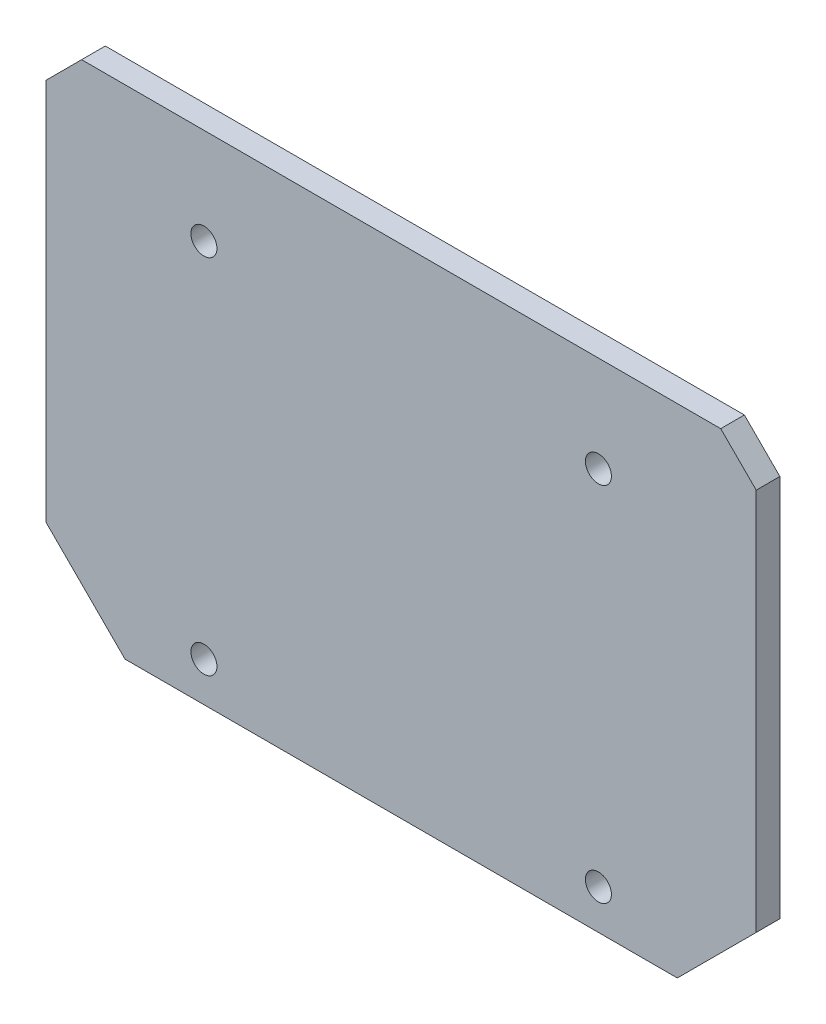
ISO-10303-21;
HEADER;
FILE_DESCRIPTION(('STEP AP214'),'2;1');
FILE_NAME('part.step','',(''),(''),'','','');
FILE_SCHEMA(('AUTOMOTIVE_DESIGN { 1 0 10303 214 1 1 1 1 }'));
ENDSEC;
DATA;
#1=APPLICATION_CONTEXT('core data for automotive mechanical design processes');
#2=APPLICATION_PROTOCOL_DEFINITION('international standard','automotive_design',2000,#1);
#3=PRODUCT_CONTEXT('',#1,'mechanical');
#4=PRODUCT('Part','Part','',(#3));
#5=PRODUCT_RELATED_PRODUCT_CATEGORY('part','',(#4));
#6=PRODUCT_DEFINITION_FORMATION('','',#4);
#7=PRODUCT_DEFINITION_CONTEXT('part definition',#1,'design');
#8=PRODUCT_DEFINITION('design','',#6,#7);
#9=PRODUCT_DEFINITION_SHAPE('','',#8);
#10=(LENGTH_UNIT() NAMED_UNIT(*) SI_UNIT(.MILLI.,.METRE.));
#11=(NAMED_UNIT(*) PLANE_ANGLE_UNIT() SI_UNIT($,.RADIAN.));
#12=(NAMED_UNIT(*) SI_UNIT($,.STERADIAN.) SOLID_ANGLE_UNIT());
#13=UNCERTAINTY_MEASURE_WITH_UNIT(LENGTH_MEASURE(1.E-05),#10,'distance_accuracy_value','');
#14=(GEOMETRIC_REPRESENTATION_CONTEXT(3) GLOBAL_UNCERTAINTY_ASSIGNED_CONTEXT((#13)) GLOBAL_UNIT_ASSIGNED_CONTEXT((#10,
#11,#12)) REPRESENTATION_CONTEXT('',''));
#15=CARTESIAN_POINT('',(0.,0.,0.));
#16=DIRECTION('',(0.,0.,1.));
#17=DIRECTION('',(1.,0.,0.));
#18=AXIS2_PLACEMENT_3D('',#15,#16,#17);
#19=CARTESIAN_POINT('',(0.,0.,3.));
#20=DIRECTION('',(0.,0.,-1.));
#21=DIRECTION('',(-1.,0.,0.));
#22=AXIS2_PLACEMENT_3D('',#19,#20,#21);
#23=PLANE('',#22);
#24=CARTESIAN_POINT('',(-39.4471834230936,-108.639958181663,3.));
#25=DIRECTION('',(0.,0.,1.));
#26=DIRECTION('',(-1.,0.,0.));
#27=AXIS2_PLACEMENT_3D('',#24,#25,#26);
#28=CIRCLE('',#27,1.65);
#29=CARTESIAN_POINT('',(-41.0971834230936,-108.639958181663,3.));
#30=VERTEX_POINT('',#29);
#31=EDGE_CURVE('E184',#30,#30,#28,.T.);
#32=ORIENTED_EDGE('',*,*,#31,.F.);
#33=EDGE_LOOP('',(#32));
#34=FACE_BOUND('',#33,.T.);
#35=CARTESIAN_POINT('',(10.5528165769064,-108.639958181663,3.));
#36=DIRECTION('',(0.,0.,1.));
#37=DIRECTION('',(-1.,0.,0.));
#38=AXIS2_PLACEMENT_3D('',#35,#36,#37);
#39=CIRCLE('',#38,1.65);
#40=CARTESIAN_POINT('',(8.90281657690642,-108.639958181663,3.));
#41=VERTEX_POINT('',#40);
#42=EDGE_CURVE('E132',#41,#41,#39,.T.);
#43=ORIENTED_EDGE('',*,*,#42,.F.);
#44=EDGE_LOOP('',(#43));
#45=FACE_BOUND('',#44,.T.);
#46=DIRECTION('',(-0.70710678118655,0.707106781186545,0.));
#47=VECTOR('',#46,1.);
#48=CARTESIAN_POINT('',(26.0528165769063,-50.5907351629899,3.));
#49=LINE('',#48,#47);
#50=CARTESIAN_POINT('',(30.5528165769063,-55.0907351629899,3.));
#51=VERTEX_POINT('',#50);
#52=CARTESIAN_POINT('',(26.0528165769063,-50.5907351629899,3.));
#53=VERTEX_POINT('',#52);
#54=EDGE_CURVE('E123',#51,#53,#49,.T.);
#55=ORIENTED_EDGE('',*,*,#54,.T.);
#56=DIRECTION('',(-1.,0.,0.));
#57=VECTOR('',#56,1.);
#58=CARTESIAN_POINT('',(-54.4471834230937,-50.59073516299,3.));
#59=LINE('',#58,#57);
#60=CARTESIAN_POINT('',(-54.9471834230937,-50.59073516299,3.));
#61=VERTEX_POINT('',#60);
#62=EDGE_CURVE('E49',#53,#61,#59,.T.);
#63=ORIENTED_EDGE('',*,*,#62,.T.);
#64=DIRECTION('',(-0.707106781186548,-0.707106781186548,0.));
#65=VECTOR('',#64,1.);
#66=CARTESIAN_POINT('',(-54.9471834230937,-50.59073516299,3.));
#67=LINE('',#66,#65);
#68=CARTESIAN_POINT('',(-59.4471834230937,-55.09073516299,3.));
#69=VERTEX_POINT('',#68);
#70=EDGE_CURVE('E178',#61,#69,#67,.T.);
#71=ORIENTED_EDGE('',*,*,#70,.T.);
#72=DIRECTION('',(0.,-1.,0.));
#73=VECTOR('',#72,1.);
#74=CARTESIAN_POINT('',(-59.4471834230937,-55.09073516299,3.));
#75=LINE('',#74,#73);
#76=CARTESIAN_POINT('',(-59.4471834230937,-103.639958181663,3.));
#77=VERTEX_POINT('',#76);
#78=EDGE_CURVE('E158',#69,#77,#75,.T.);
#79=ORIENTED_EDGE('',*,*,#78,.T.);
#80=DIRECTION('',(0.707106781186548,-0.707106781186547,0.));
#81=VECTOR('',#80,1.);
#82=CARTESIAN_POINT('',(-59.4471834230937,-103.639958181663,3.));
#83=LINE('',#82,#81);
#84=CARTESIAN_POINT('',(-49.4471834230937,-113.639958181663,3.));
#85=VERTEX_POINT('',#84);
#86=EDGE_CURVE('E174',#77,#85,#83,.T.);
#87=ORIENTED_EDGE('',*,*,#86,.T.);
#88=DIRECTION('',(1.,0.,0.));
#89=VECTOR('',#88,1.);
#90=CARTESIAN_POINT('',(-49.4471834230937,-113.639958181663,3.));
#91=LINE('',#90,#89);
#92=CARTESIAN_POINT('',(20.5528165769063,-113.639958181663,3.));
#93=VERTEX_POINT('',#92);
#94=EDGE_CURVE('E109',#85,#93,#91,.T.);
#95=ORIENTED_EDGE('',*,*,#94,.T.);
#96=DIRECTION('',(0.707106781186548,0.707106781186547,0.));
#97=VECTOR('',#96,1.);
#98=CARTESIAN_POINT('',(30.5528165769063,-103.639958181663,3.));
#99=LINE('',#98,#97);
#100=CARTESIAN_POINT('',(30.5528165769063,-103.639958181663,3.));
#101=VERTEX_POINT('',#100);
#102=EDGE_CURVE('E103',#93,#101,#99,.T.);
#103=ORIENTED_EDGE('',*,*,#102,.T.);
#104=DIRECTION('',(0.,1.,0.));
#105=VECTOR('',#104,1.);
#106=CARTESIAN_POINT('',(30.5528165769063,-55.0907351629899,3.));
#107=LINE('',#106,#105);
#108=EDGE_CURVE('E107',#101,#51,#107,.T.);
#109=ORIENTED_EDGE('',*,*,#108,.T.);
#110=EDGE_LOOP('',(#55,#63,#71,#79,#87,#95,#103,#109));
#111=FACE_BOUND('',#110,.T.);
#112=CARTESIAN_POINT('',(10.5528165769064,-62.7480571612415,3.));
#113=DIRECTION('',(0.,0.,1.));
#114=DIRECTION('',(1.,0.,0.));
#115=AXIS2_PLACEMENT_3D('',#112,#113,#114);
#116=CIRCLE('',#115,1.65);
#117=CARTESIAN_POINT('',(12.2028165769064,-62.7480571612415,3.));
#118=VERTEX_POINT('',#117);
#119=EDGE_CURVE('E190',#118,#118,#116,.T.);
#120=ORIENTED_EDGE('',*,*,#119,.F.);
#121=EDGE_LOOP('',(#120));
#122=FACE_BOUND('',#121,.T.);
#123=CARTESIAN_POINT('',(-39.4471834230938,-62.7480571612414,3.));
#124=DIRECTION('',(0.,0.,1.));
#125=DIRECTION('',(-1.,0.,0.));
#126=AXIS2_PLACEMENT_3D('',#123,#124,#125);
#127=CIRCLE('',#126,1.65);
#128=CARTESIAN_POINT('',(-41.0971834230938,-62.7480571612414,3.));
#129=VERTEX_POINT('',#128);
#130=EDGE_CURVE('E196',#129,#129,#127,.T.);
#131=ORIENTED_EDGE('',*,*,#130,.F.);
#132=EDGE_LOOP('',(#131));
#133=FACE_BOUND('',#132,.T.);
#134=ADVANCED_FACE('F32',(#34,#45,#111,#122,#133),#23,.F.);
#135=CARTESIAN_POINT('',(0.,0.,0.));
#136=DIRECTION('',(0.,0.,-1.));
#137=DIRECTION('',(-1.,0.,0.));
#138=AXIS2_PLACEMENT_3D('',#135,#136,#137);
#139=PLANE('',#138);
#140=DIRECTION('',(-0.707106781186548,-0.707106781186548,0.));
#141=VECTOR('',#140,1.);
#142=CARTESIAN_POINT('',(-54.9471834230937,-50.59073516299,0.));
#143=LINE('',#142,#141);
#144=CARTESIAN_POINT('',(-54.9471834230937,-50.59073516299,0.));
#145=VERTEX_POINT('',#144);
#146=CARTESIAN_POINT('',(-59.4471834230937,-55.09073516299,0.));
#147=VERTEX_POINT('',#146);
#148=EDGE_CURVE('E129',#145,#147,#143,.T.);
#149=ORIENTED_EDGE('',*,*,#148,.F.);
#150=DIRECTION('',(-1.,0.,0.));
#151=VECTOR('',#150,1.);
#152=CARTESIAN_POINT('',(25.5528165769063,-50.5907351629899,0.));
#153=LINE('',#152,#151);
#154=CARTESIAN_POINT('',(26.0528165769063,-50.5907351629899,0.));
#155=VERTEX_POINT('',#154);
#156=EDGE_CURVE('E141',#155,#145,#153,.T.);
#157=ORIENTED_EDGE('',*,*,#156,.F.);
#158=DIRECTION('',(-0.70710678118655,0.707106781186545,0.));
#159=VECTOR('',#158,1.);
#160=CARTESIAN_POINT('',(26.0528165769063,-50.5907351629899,0.));
#161=LINE('',#160,#159);
#162=CARTESIAN_POINT('',(30.5528165769063,-55.0907351629899,0.));
#163=VERTEX_POINT('',#162);
#164=EDGE_CURVE('E86',#163,#155,#161,.T.);
#165=ORIENTED_EDGE('',*,*,#164,.F.);
#166=DIRECTION('',(0.,1.,0.));
#167=VECTOR('',#166,1.);
#168=CARTESIAN_POINT('',(30.5528165769063,-55.0907351629899,0.));
#169=LINE('',#168,#167);
#170=CARTESIAN_POINT('',(30.5528165769063,-103.639958181663,0.));
#171=VERTEX_POINT('',#170);
#172=EDGE_CURVE('E79',#171,#163,#169,.T.);
#173=ORIENTED_EDGE('',*,*,#172,.F.);
#174=DIRECTION('',(0.707106781186548,0.707106781186547,0.));
#175=VECTOR('',#174,1.);
#176=CARTESIAN_POINT('',(30.5528165769063,-103.639958181663,0.));
#177=LINE('',#176,#175);
#178=CARTESIAN_POINT('',(20.5528165769063,-113.639958181663,0.));
#179=VERTEX_POINT('',#178);
#180=EDGE_CURVE('E117',#179,#171,#177,.T.);
#181=ORIENTED_EDGE('',*,*,#180,.F.);
#182=DIRECTION('',(1.,0.,0.));
#183=VECTOR('',#182,1.);
#184=CARTESIAN_POINT('',(-49.4471834230937,-113.639958181663,0.));
#185=LINE('',#184,#183);
#186=CARTESIAN_POINT('',(-49.4471834230937,-113.639958181663,0.));
#187=VERTEX_POINT('',#186);
#188=EDGE_CURVE('E136',#187,#179,#185,.T.);
#189=ORIENTED_EDGE('',*,*,#188,.F.);
#190=DIRECTION('',(0.707106781186548,-0.707106781186547,0.));
#191=VECTOR('',#190,1.);
#192=CARTESIAN_POINT('',(-59.4471834230937,-103.639958181663,0.));
#193=LINE('',#192,#191);
#194=CARTESIAN_POINT('',(-59.4471834230937,-103.639958181663,0.));
#195=VERTEX_POINT('',#194);
#196=EDGE_CURVE('E134',#195,#187,#193,.T.);
#197=ORIENTED_EDGE('',*,*,#196,.F.);
#198=DIRECTION('',(0.,-1.,0.));
#199=VECTOR('',#198,1.);
#200=CARTESIAN_POINT('',(-59.4471834230937,-55.09073516299,0.));
#201=LINE('',#200,#199);
#202=EDGE_CURVE('E131',#147,#195,#201,.T.);
#203=ORIENTED_EDGE('',*,*,#202,.F.);
#204=EDGE_LOOP('',(#149,#157,#165,#173,#181,#189,#197,#203));
#205=FACE_BOUND('',#204,.T.);
#206=CARTESIAN_POINT('',(10.5528165769064,-62.7480571612415,0.));
#207=DIRECTION('',(0.,0.,1.));
#208=DIRECTION('',(1.,0.,0.));
#209=AXIS2_PLACEMENT_3D('',#206,#207,#208);
#210=CIRCLE('',#209,1.65);
#211=CARTESIAN_POINT('',(12.2028165769064,-62.7480571612415,0.));
#212=VERTEX_POINT('',#211);
#213=EDGE_CURVE('E193',#212,#212,#210,.T.);
#214=ORIENTED_EDGE('',*,*,#213,.T.);
#215=EDGE_LOOP('',(#214));
#216=FACE_BOUND('',#215,.T.);
#217=CARTESIAN_POINT('',(10.5528165769064,-108.639958181663,0.));
#218=DIRECTION('',(0.,0.,1.));
#219=DIRECTION('',(-1.,0.,0.));
#220=AXIS2_PLACEMENT_3D('',#217,#218,#219);
#221=CIRCLE('',#220,1.65);
#222=CARTESIAN_POINT('',(8.90281657690642,-108.639958181663,0.));
#223=VERTEX_POINT('',#222);
#224=EDGE_CURVE('E181',#223,#223,#221,.T.);
#225=ORIENTED_EDGE('',*,*,#224,.T.);
#226=EDGE_LOOP('',(#225));
#227=FACE_BOUND('',#226,.T.);
#228=CARTESIAN_POINT('',(-39.4471834230936,-108.639958181663,0.));
#229=DIRECTION('',(0.,0.,1.));
#230=DIRECTION('',(-1.,0.,0.));
#231=AXIS2_PLACEMENT_3D('',#228,#229,#230);
#232=CIRCLE('',#231,1.65);
#233=CARTESIAN_POINT('',(-41.0971834230936,-108.639958181663,0.));
#234=VERTEX_POINT('',#233);
#235=EDGE_CURVE('E187',#234,#234,#232,.T.);
#236=ORIENTED_EDGE('',*,*,#235,.T.);
#237=EDGE_LOOP('',(#236));
#238=FACE_BOUND('',#237,.T.);
#239=CARTESIAN_POINT('',(-39.4471834230938,-62.7480571612414,0.));
#240=DIRECTION('',(0.,0.,1.));
#241=DIRECTION('',(-1.,0.,0.));
#242=AXIS2_PLACEMENT_3D('',#239,#240,#241);
#243=CIRCLE('',#242,1.65);
#244=CARTESIAN_POINT('',(-41.0971834230938,-62.7480571612414,0.));
#245=VERTEX_POINT('',#244);
#246=EDGE_CURVE('E199',#245,#245,#243,.T.);
#247=ORIENTED_EDGE('',*,*,#246,.T.);
#248=EDGE_LOOP('',(#247));
#249=FACE_BOUND('',#248,.T.);
#250=ADVANCED_FACE('F164',(#205,#216,#227,#238,#249),#139,.T.);
#251=CARTESIAN_POINT('',(-54.9471834230937,-50.59073516299,3.));
#252=DIRECTION('',(0.707106781186547,-0.707106781186547,0.));
#253=DIRECTION('',(0.707106781186548,0.707106781186548,0.));
#254=AXIS2_PLACEMENT_3D('',#251,#252,#253);
#255=PLANE('',#254);
#256=ORIENTED_EDGE('',*,*,#148,.T.);
#257=DIRECTION('',(0.,0.,-1.));
#258=VECTOR('',#257,1.);
#259=CARTESIAN_POINT('',(-59.4471834230937,-55.09073516299,3.));
#260=LINE('',#259,#258);
#261=EDGE_CURVE('E41',#69,#147,#260,.T.);
#262=ORIENTED_EDGE('',*,*,#261,.F.);
#263=ORIENTED_EDGE('',*,*,#70,.F.);
#264=DIRECTION('',(0.,0.,-1.));
#265=VECTOR('',#264,1.);
#266=CARTESIAN_POINT('',(-54.9471834230937,-50.59073516299,3.));
#267=LINE('',#266,#265);
#268=EDGE_CURVE('E11',#61,#145,#267,.T.);
#269=ORIENTED_EDGE('',*,*,#268,.T.);
#270=EDGE_LOOP('',(#256,#262,#263,#269));
#271=FACE_BOUND('',#270,.T.);
#272=ADVANCED_FACE('F34',(#271),#255,.F.);
#273=CARTESIAN_POINT('',(-59.4471834230937,-55.09073516299,3.));
#274=DIRECTION('',(1.,0.,0.));
#275=DIRECTION('',(0.,1.,0.));
#276=AXIS2_PLACEMENT_3D('',#273,#274,#275);
#277=PLANE('',#276);
#278=ORIENTED_EDGE('',*,*,#202,.T.);
#279=DIRECTION('',(0.,0.,-1.));
#280=VECTOR('',#279,1.);
#281=CARTESIAN_POINT('',(-59.4471834230937,-103.639958181663,3.));
#282=LINE('',#281,#280);
#283=EDGE_CURVE('E149',#77,#195,#282,.T.);
#284=ORIENTED_EDGE('',*,*,#283,.F.);
#285=ORIENTED_EDGE('',*,*,#78,.F.);
#286=ORIENTED_EDGE('',*,*,#261,.T.);
#287=EDGE_LOOP('',(#278,#284,#285,#286));
#288=FACE_BOUND('',#287,.T.);
#289=ADVANCED_FACE('F156',(#288),#277,.F.);
#290=CARTESIAN_POINT('',(-59.4471834230937,-103.639958181663,3.));
#291=DIRECTION('',(0.707106781186547,0.707106781186548,0.));
#292=DIRECTION('',(-0.707106781186548,0.707106781186547,0.));
#293=AXIS2_PLACEMENT_3D('',#290,#291,#292);
#294=PLANE('',#293);
#295=ORIENTED_EDGE('',*,*,#196,.T.);
#296=DIRECTION('',(0.,0.,-1.));
#297=VECTOR('',#296,1.);
#298=CARTESIAN_POINT('',(-49.4471834230937,-113.639958181663,3.));
#299=LINE('',#298,#297);
#300=EDGE_CURVE('E146',#85,#187,#299,.T.);
#301=ORIENTED_EDGE('',*,*,#300,.F.);
#302=ORIENTED_EDGE('',*,*,#86,.F.);
#303=ORIENTED_EDGE('',*,*,#283,.T.);
#304=EDGE_LOOP('',(#295,#301,#302,#303));
#305=FACE_BOUND('',#304,.T.);
#306=ADVANCED_FACE('F170',(#305),#294,.F.);
#307=CARTESIAN_POINT('',(-49.4471834230937,-113.639958181663,3.));
#308=DIRECTION('',(0.,1.,0.));
#309=DIRECTION('',(0.,0.,1.));
#310=AXIS2_PLACEMENT_3D('',#307,#308,#309);
#311=PLANE('',#310);
#312=ORIENTED_EDGE('',*,*,#188,.T.);
#313=DIRECTION('',(0.,0.,-1.));
#314=VECTOR('',#313,1.);
#315=CARTESIAN_POINT('',(20.5528165769063,-113.639958181663,3.));
#316=LINE('',#315,#314);
#317=EDGE_CURVE('E118',#93,#179,#316,.T.);
#318=ORIENTED_EDGE('',*,*,#317,.F.);
#319=ORIENTED_EDGE('',*,*,#94,.F.);
#320=ORIENTED_EDGE('',*,*,#300,.T.);
#321=EDGE_LOOP('',(#312,#318,#319,#320));
#322=FACE_BOUND('',#321,.T.);
#323=ADVANCED_FACE('F173',(#322),#311,.F.);
#324=CARTESIAN_POINT('',(30.5528165769063,-103.639958181663,3.));
#325=DIRECTION('',(-0.707106781186547,0.707106781186548,0.));
#326=DIRECTION('',(-0.707106781186548,-0.707106781186547,0.));
#327=AXIS2_PLACEMENT_3D('',#324,#325,#326);
#328=PLANE('',#327);
#329=ORIENTED_EDGE('',*,*,#180,.T.);
#330=DIRECTION('',(0.,0.,-1.));
#331=VECTOR('',#330,1.);
#332=CARTESIAN_POINT('',(30.5528165769063,-103.639958181663,3.));
#333=LINE('',#332,#331);
#334=EDGE_CURVE('E114',#101,#171,#333,.T.);
#335=ORIENTED_EDGE('',*,*,#334,.F.);
#336=ORIENTED_EDGE('',*,*,#102,.F.);
#337=ORIENTED_EDGE('',*,*,#317,.T.);
#338=EDGE_LOOP('',(#329,#335,#336,#337));
#339=FACE_BOUND('',#338,.T.);
#340=ADVANCED_FACE('F115',(#339),#328,.F.);
#341=CARTESIAN_POINT('',(30.5528165769063,-55.0907351629899,3.));
#342=DIRECTION('',(-1.,0.,0.));
#343=DIRECTION('',(0.,0.,1.));
#344=AXIS2_PLACEMENT_3D('',#341,#342,#343);
#345=PLANE('',#344);
#346=ORIENTED_EDGE('',*,*,#172,.T.);
#347=DIRECTION('',(0.,0.,-1.));
#348=VECTOR('',#347,1.);
#349=CARTESIAN_POINT('',(30.5528165769063,-55.0907351629899,3.));
#350=LINE('',#349,#348);
#351=EDGE_CURVE('E119',#51,#163,#350,.T.);
#352=ORIENTED_EDGE('',*,*,#351,.F.);
#353=ORIENTED_EDGE('',*,*,#108,.F.);
#354=ORIENTED_EDGE('',*,*,#334,.T.);
#355=EDGE_LOOP('',(#346,#352,#353,#354));
#356=FACE_BOUND('',#355,.T.);
#357=ADVANCED_FACE('F121',(#356),#345,.F.);
#358=CARTESIAN_POINT('',(26.0528165769063,-50.5907351629899,3.));
#359=DIRECTION('',(-0.707106781186545,-0.70710678118655,0.));
#360=DIRECTION('',(0.70710678118655,-0.707106781186545,0.));
#361=AXIS2_PLACEMENT_3D('',#358,#359,#360);
#362=PLANE('',#361);
#363=ORIENTED_EDGE('',*,*,#164,.T.);
#364=DIRECTION('',(0.,0.,-1.));
#365=VECTOR('',#364,1.);
#366=CARTESIAN_POINT('',(26.0528165769063,-50.5907351629899,3.));
#367=LINE('',#366,#365);
#368=EDGE_CURVE('E125',#53,#155,#367,.T.);
#369=ORIENTED_EDGE('',*,*,#368,.F.);
#370=ORIENTED_EDGE('',*,*,#54,.F.);
#371=ORIENTED_EDGE('',*,*,#351,.T.);
#372=EDGE_LOOP('',(#363,#369,#370,#371));
#373=FACE_BOUND('',#372,.T.);
#374=ADVANCED_FACE('F224',(#373),#362,.F.);
#375=CARTESIAN_POINT('',(25.5528165769063,-50.5907351629899,3.));
#376=DIRECTION('',(0.,-1.,0.));
#377=DIRECTION('',(0.,0.,-1.));
#378=AXIS2_PLACEMENT_3D('',#375,#376,#377);
#379=PLANE('',#378);
#380=ORIENTED_EDGE('',*,*,#156,.T.);
#381=ORIENTED_EDGE('',*,*,#268,.F.);
#382=ORIENTED_EDGE('',*,*,#62,.F.);
#383=ORIENTED_EDGE('',*,*,#368,.T.);
#384=EDGE_LOOP('',(#380,#381,#382,#383));
#385=FACE_BOUND('',#384,.T.);
#386=ADVANCED_FACE('F221',(#385),#379,.F.);
#387=CARTESIAN_POINT('',(10.5528165769064,-108.639958181663,3.));
#388=DIRECTION('',(0.,0.,-1.));
#389=DIRECTION('',(-1.,0.,0.));
#390=AXIS2_PLACEMENT_3D('',#387,#388,#389);
#391=CYLINDRICAL_SURFACE('',#390,1.65);
#392=ORIENTED_EDGE('',*,*,#42,.T.);
#393=EDGE_LOOP('',(#392));
#394=FACE_BOUND('',#393,.T.);
#395=ORIENTED_EDGE('',*,*,#224,.F.);
#396=EDGE_LOOP('',(#395));
#397=FACE_BOUND('',#396,.T.);
#398=ADVANCED_FACE('F218',(#394,#397),#391,.F.);
#399=CARTESIAN_POINT('',(-39.4471834230936,-108.639958181663,3.));
#400=DIRECTION('',(0.,0.,-1.));
#401=DIRECTION('',(-1.,0.,0.));
#402=AXIS2_PLACEMENT_3D('',#399,#400,#401);
#403=CYLINDRICAL_SURFACE('',#402,1.65);
#404=ORIENTED_EDGE('',*,*,#31,.T.);
#405=EDGE_LOOP('',(#404));
#406=FACE_BOUND('',#405,.T.);
#407=ORIENTED_EDGE('',*,*,#235,.F.);
#408=EDGE_LOOP('',(#407));
#409=FACE_BOUND('',#408,.T.);
#410=ADVANCED_FACE('F264',(#406,#409),#403,.F.);
#411=CARTESIAN_POINT('',(10.5528165769064,-62.7480571612415,3.));
#412=DIRECTION('',(0.,0.,-1.));
#413=DIRECTION('',(-1.,0.,0.));
#414=AXIS2_PLACEMENT_3D('',#411,#412,#413);
#415=CYLINDRICAL_SURFACE('',#414,1.65);
#416=ORIENTED_EDGE('',*,*,#119,.T.);
#417=EDGE_LOOP('',(#416));
#418=FACE_BOUND('',#417,.T.);
#419=ORIENTED_EDGE('',*,*,#213,.F.);
#420=EDGE_LOOP('',(#419));
#421=FACE_BOUND('',#420,.T.);
#422=ADVANCED_FACE('F271',(#418,#421),#415,.F.);
#423=CARTESIAN_POINT('',(-39.4471834230938,-62.7480571612414,3.));
#424=DIRECTION('',(0.,0.,-1.));
#425=DIRECTION('',(-1.,0.,0.));
#426=AXIS2_PLACEMENT_3D('',#423,#424,#425);
#427=CYLINDRICAL_SURFACE('',#426,1.65);
#428=ORIENTED_EDGE('',*,*,#130,.T.);
#429=EDGE_LOOP('',(#428));
#430=FACE_BOUND('',#429,.T.);
#431=ORIENTED_EDGE('',*,*,#246,.F.);
#432=EDGE_LOOP('',(#431));
#433=FACE_BOUND('',#432,.T.);
#434=ADVANCED_FACE('F205',(#430,#433),#427,.F.);
#435=CLOSED_SHELL('',(#134,#250,#272,#289,#306,#323,#340,#357,#374,#386,#398,#410,#422,#434));
#436=MANIFOLD_SOLID_BREP('B2',#435);
#437=ADVANCED_BREP_SHAPE_REPRESENTATION('',(#18,#436),#14);
#438=SHAPE_DEFINITION_REPRESENTATION(#9,#437);
ENDSEC;
END-ISO-10303-21;
